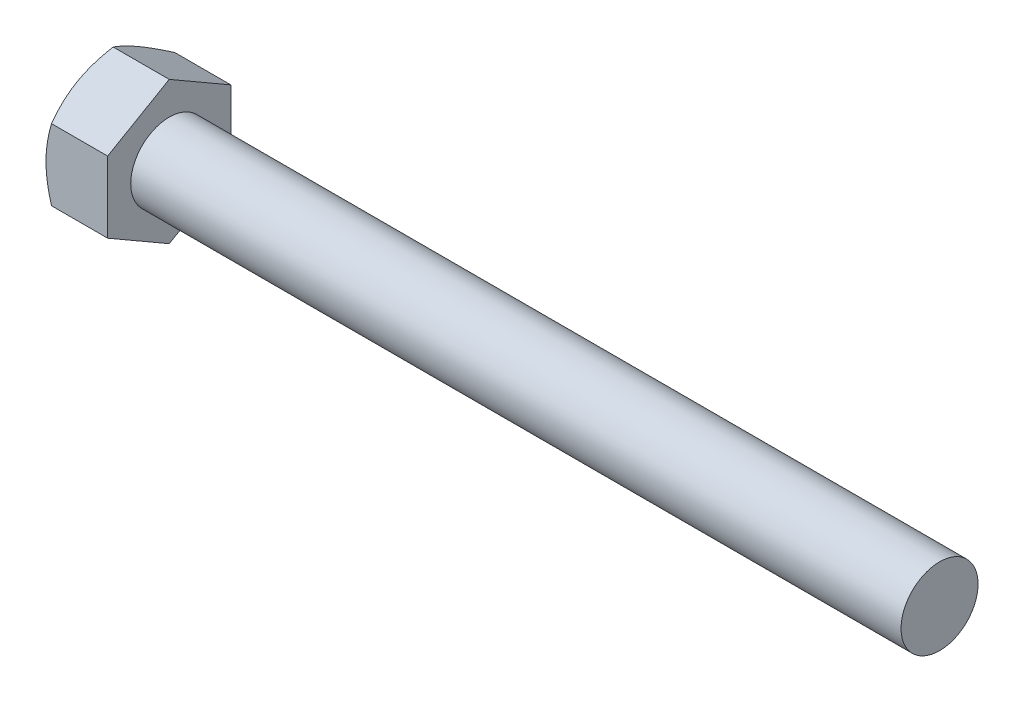
ISO-10303-21;
HEADER;
FILE_DESCRIPTION(('STEP AP214'),'2;1');
FILE_NAME('part.step','',(''),(''),'','','');
FILE_SCHEMA(('AUTOMOTIVE_DESIGN { 1 0 10303 214 1 1 1 1 }'));
ENDSEC;
DATA;
#1=APPLICATION_CONTEXT('core data for automotive mechanical design processes');
#2=APPLICATION_PROTOCOL_DEFINITION('international standard','automotive_design',2000,#1);
#3=PRODUCT_CONTEXT('',#1,'mechanical');
#4=PRODUCT('Part','Part','',(#3));
#5=PRODUCT_RELATED_PRODUCT_CATEGORY('part','',(#4));
#6=PRODUCT_DEFINITION_FORMATION('','',#4);
#7=PRODUCT_DEFINITION_CONTEXT('part definition',#1,'design');
#8=PRODUCT_DEFINITION('design','',#6,#7);
#9=PRODUCT_DEFINITION_SHAPE('','',#8);
#10=(LENGTH_UNIT() NAMED_UNIT(*) SI_UNIT(.MILLI.,.METRE.));
#11=(NAMED_UNIT(*) PLANE_ANGLE_UNIT() SI_UNIT($,.RADIAN.));
#12=(NAMED_UNIT(*) SI_UNIT($,.STERADIAN.) SOLID_ANGLE_UNIT());
#13=UNCERTAINTY_MEASURE_WITH_UNIT(LENGTH_MEASURE(1.E-05),#10,'distance_accuracy_value','');
#14=(GEOMETRIC_REPRESENTATION_CONTEXT(3) GLOBAL_UNCERTAINTY_ASSIGNED_CONTEXT((#13)) GLOBAL_UNIT_ASSIGNED_CONTEXT((#10,
#11,#12)) REPRESENTATION_CONTEXT('',''));
#15=CARTESIAN_POINT('',(0.,0.,0.));
#16=DIRECTION('',(0.,0.,1.));
#17=DIRECTION('',(1.,0.,0.));
#18=AXIS2_PLACEMENT_3D('',#15,#16,#17);
#19=CARTESIAN_POINT('',(1.6,1.,0.));
#20=DIRECTION('',(-1.,0.,0.));
#21=DIRECTION('',(0.,0.,1.));
#22=AXIS2_PLACEMENT_3D('',#19,#20,#21);
#23=PLANE('',#22);
#24=CARTESIAN_POINT('',(1.6,0.,0.));
#25=DIRECTION('',(-1.,0.,0.));
#26=DIRECTION('',(0.,0.,1.));
#27=AXIS2_PLACEMENT_3D('',#24,#25,#26);
#28=CIRCLE('',#27,1.);
#29=CARTESIAN_POINT('',(1.6,0.,1.));
#30=VERTEX_POINT('',#29);
#31=EDGE_CURVE('E195',#30,#30,#28,.T.);
#32=ORIENTED_EDGE('',*,*,#31,.T.);
#33=EDGE_LOOP('',(#32));
#34=FACE_BOUND('',#33,.T.);
#35=DIRECTION('',(0.,1.,0.));
#36=VECTOR('',#35,1.);
#37=CARTESIAN_POINT('',(1.6,-0.923760434740009,1.6));
#38=LINE('',#37,#36);
#39=CARTESIAN_POINT('',(1.6,-0.923760434740009,1.6));
#40=VERTEX_POINT('',#39);
#41=CARTESIAN_POINT('',(1.6,0.923760434740264,1.6));
#42=VERTEX_POINT('',#41);
#43=EDGE_CURVE('E55',#40,#42,#38,.T.);
#44=ORIENTED_EDGE('',*,*,#43,.F.);
#45=DIRECTION('',(0.,0.500000001638709,0.86602540283833));
#46=VECTOR('',#45,1.);
#47=CARTESIAN_POINT('',(1.6,-1.84752086948014,0.));
#48=LINE('',#47,#46);
#49=CARTESIAN_POINT('',(1.6,-1.84752086948014,0.));
#50=VERTEX_POINT('',#49);
#51=EDGE_CURVE('E128',#50,#40,#48,.T.);
#52=ORIENTED_EDGE('',*,*,#51,.F.);
#53=DIRECTION('',(0.,-0.500000001638709,0.866025402838329));
#54=VECTOR('',#53,1.);
#55=CARTESIAN_POINT('',(1.6,-0.923760434740009,-1.6));
#56=LINE('',#55,#54);
#57=CARTESIAN_POINT('',(1.6,-0.923760434740009,-1.6));
#58=VERTEX_POINT('',#57);
#59=EDGE_CURVE('E126',#58,#50,#56,.T.);
#60=ORIENTED_EDGE('',*,*,#59,.F.);
#61=DIRECTION('',(0.,-1.,0.));
#62=VECTOR('',#61,1.);
#63=CARTESIAN_POINT('',(1.6,0.923760434740264,-1.6));
#64=LINE('',#63,#62);
#65=CARTESIAN_POINT('',(1.6,0.923760434740264,-1.6));
#66=VERTEX_POINT('',#65);
#67=EDGE_CURVE('E109',#66,#58,#64,.T.);
#68=ORIENTED_EDGE('',*,*,#67,.F.);
#69=DIRECTION('',(0.,-0.50000000163871,-0.866025402838329));
#70=VECTOR('',#69,1.);
#71=CARTESIAN_POINT('',(1.6,1.8475208694804,0.));
#72=LINE('',#71,#70);
#73=CARTESIAN_POINT('',(1.6,1.8475208694804,0.));
#74=VERTEX_POINT('',#73);
#75=EDGE_CURVE('E118',#74,#66,#72,.T.);
#76=ORIENTED_EDGE('',*,*,#75,.F.);
#77=DIRECTION('',(0.,0.50000000163871,-0.866025402838329));
#78=VECTOR('',#77,1.);
#79=CARTESIAN_POINT('',(1.6,0.923760434740264,1.6));
#80=LINE('',#79,#78);
#81=EDGE_CURVE('E122',#42,#74,#80,.T.);
#82=ORIENTED_EDGE('',*,*,#81,.F.);
#83=EDGE_LOOP('',(#44,#52,#60,#68,#76,#82));
#84=FACE_BOUND('',#83,.T.);
#85=ADVANCED_FACE('F32',(#34,#84),#23,.F.);
#86=CARTESIAN_POINT('',(-25.4,0.,0.));
#87=DIRECTION('',(-1.,0.,0.));
#88=DIRECTION('',(0.,0.,1.));
#89=AXIS2_PLACEMENT_3D('',#86,#87,#88);
#90=CYLINDRICAL_SURFACE('',#89,1.);
#91=CARTESIAN_POINT('',(21.6,0.,0.));
#92=DIRECTION('',(-1.,0.,0.));
#93=DIRECTION('',(0.,0.,1.));
#94=AXIS2_PLACEMENT_3D('',#91,#92,#93);
#95=CIRCLE('',#94,1.);
#96=CARTESIAN_POINT('',(21.6,0.,1.));
#97=VERTEX_POINT('',#96);
#98=EDGE_CURVE('E11',#97,#97,#95,.T.);
#99=ORIENTED_EDGE('',*,*,#98,.T.);
#100=EDGE_LOOP('',(#99));
#101=FACE_BOUND('',#100,.T.);
#102=ORIENTED_EDGE('',*,*,#31,.F.);
#103=EDGE_LOOP('',(#102));
#104=FACE_BOUND('',#103,.T.);
#105=ADVANCED_FACE('F34',(#101,#104),#90,.T.);
#106=CARTESIAN_POINT('',(21.6,1.,0.));
#107=DIRECTION('',(1.,0.,0.));
#108=DIRECTION('',(0.,0.,-1.));
#109=AXIS2_PLACEMENT_3D('',#106,#107,#108);
#110=PLANE('',#109);
#111=ORIENTED_EDGE('',*,*,#98,.F.);
#112=EDGE_LOOP('',(#111));
#113=FACE_BOUND('',#112,.T.);
#114=ADVANCED_FACE('F176',(#113),#110,.T.);
#115=CARTESIAN_POINT('',(1.6,-0.923760434740009,1.6));
#116=DIRECTION('',(0.,0.,1.));
#117=DIRECTION('',(0.,-1.,0.));
#118=AXIS2_PLACEMENT_3D('',#115,#116,#117);
#119=PLANE('',#118);
#120=DIRECTION('',(-1.,0.,0.));
#121=VECTOR('',#120,1.);
#122=CARTESIAN_POINT('',(1.6,-0.923760434740009,1.6));
#123=LINE('',#122,#121);
#124=CARTESIAN_POINT('',(0.142906237128534,-0.923760434740009,1.6));
#125=VERTEX_POINT('',#124);
#126=EDGE_CURVE('E135',#40,#125,#123,.T.);
#127=ORIENTED_EDGE('',*,*,#126,.F.);
#128=ORIENTED_EDGE('',*,*,#43,.T.);
#129=DIRECTION('',(-1.,0.,0.));
#130=VECTOR('',#129,1.);
#131=CARTESIAN_POINT('',(1.6,0.923760434740264,1.6));
#132=LINE('',#131,#130);
#133=CARTESIAN_POINT('',(0.142906237128605,0.923760434740264,1.6));
#134=VERTEX_POINT('',#133);
#135=EDGE_CURVE('E134',#42,#134,#132,.T.);
#136=ORIENTED_EDGE('',*,*,#135,.T.);
#137=CARTESIAN_POINT('',(0.765644828202179,-2.44995313964442,1.60000000000001));
#138=CARTESIAN_POINT('',(0.731696573650797,-2.37970405797874,1.60000000000001));
#139=CARTESIAN_POINT('',(0.698085791483846,-2.30928888479984,1.60000000000001));
#140=CARTESIAN_POINT('',(0.631732015267875,-2.16803654978859,1.60000000000001));
#141=CARTESIAN_POINT('',(0.598989171465694,-2.09719931746054,1.60000000000001));
#142=CARTESIAN_POINT('',(0.534391625180878,-1.95463040365835,1.60000000000001));
#143=CARTESIAN_POINT('',(0.502543077397541,-1.88289592340094,1.60000000000001));
#144=CARTESIAN_POINT('',(0.440213947600505,-1.73883737021895,1.60000000000001));
#145=CARTESIAN_POINT('',(0.409733294281402,-1.66651332825973,1.6));
#146=CARTESIAN_POINT('',(0.350141939702461,-1.52026304024921,1.6));
#147=CARTESIAN_POINT('',(0.321052643615894,-1.44632802431198,1.6));
#148=CARTESIAN_POINT('',(0.265152077517383,-1.29758535512184,1.6));
#149=CARTESIAN_POINT('',(0.238341078622316,-1.22277759921435,1.6));
#150=CARTESIAN_POINT('',(0.187718918744779,-1.0723280156514,1.6));
#151=CARTESIAN_POINT('',(0.163901250515315,-0.996688400121103,1.6));
#152=CARTESIAN_POINT('',(0.120035929316095,-0.844327663434869,1.6));
#153=CARTESIAN_POINT('',(0.0999873935955762,-0.767606800049038,1.6));
#154=CARTESIAN_POINT('',(0.0646370585563195,-0.613040253227076,1.6));
#155=CARTESIAN_POINT('',(0.0493363268649904,-0.53519432091214,1.6));
#156=CARTESIAN_POINT('',(0.0245099593902628,-0.378564482285491,1.6));
#157=CARTESIAN_POINT('',(0.0149843287079924,-0.29978057514533,1.6));
#158=CARTESIAN_POINT('',(0.00255348836303748,-0.142183236095495,1.6));
#159=CARTESIAN_POINT('',(-0.000393634328577223,-0.0633732093612203,1.6));
#160=CARTESIAN_POINT('',(0.000479268304523477,0.0941836095219118,1.6));
#161=CARTESIAN_POINT('',(0.00429753699197445,0.172930412775567,1.6));
#162=CARTESIAN_POINT('',(0.0213790771551431,0.363434812047489,1.6));
#163=CARTESIAN_POINT('',(0.0379858383290378,0.474893231414492,1.6));
#164=CARTESIAN_POINT('',(0.0817587899090965,0.695747937592886,1.6));
#165=CARTESIAN_POINT('',(0.108937403810862,0.805141638878416,1.6));
#166=CARTESIAN_POINT('',(0.155805981368528,0.968865723821623,1.6));
#167=CARTESIAN_POINT('',(0.172684493871444,1.02403323308235,1.6));
#168=CARTESIAN_POINT('',(0.20811227639747,1.13378937357028,1.6));
#169=CARTESIAN_POINT('',(0.226660394050068,1.18837837543755,1.6));
#170=CARTESIAN_POINT('',(0.265040726595979,1.29675310607402,1.6));
#171=CARTESIAN_POINT('',(0.284865126103106,1.35054162671599,1.6));
#172=CARTESIAN_POINT('',(0.325677517040834,1.45770134134685,1.6));
#173=CARTESIAN_POINT('',(0.34666597875204,1.51107235658078,1.6));
#174=CARTESIAN_POINT('',(0.368121670943097,1.56425000996125,1.6));
#175=B_SPLINE_CURVE_WITH_KNOTS('',3,(#137,#138,#139,#140,#141,#142,#143,#144,#145,#146,#147,
#148,#149,#150,#151,#152,#153,#154,#155,#156,#157,#158,#159,#160,#161,#162,#163,#164,#165,#166,
#167,#168,#169,#170,#171,#172,#173,#174),.UNSPECIFIED.,.F.,.F.,(4,2,2,2,2,2,2,2,2,2,2,2,2,2,2,2,
2,2,4),(0.,0.23406885323444,0.468177964432786,0.70362677994028,0.939063307715758,
1.17738940986821,1.4157438331752,1.65357078566775,1.89134196825098,2.12916657919323,
2.36699140020488,2.60329661246141,2.83954047694213,3.17691485506245,3.51468690177223,
3.68774177254085,3.86067810258333,4.03264103265922,4.20467394903791),.UNSPECIFIED.);
#176=CARTESIAN_POINT('',(0.,0.,1.6));
#177=VERTEX_POINT('',#176);
#178=EDGE_CURVE('E178',#177,#134,#175,.T.);
#179=ORIENTED_EDGE('',*,*,#178,.F.);
#180=EDGE_CURVE('E186',#125,#177,#175,.T.);
#181=ORIENTED_EDGE('',*,*,#180,.F.);
#182=EDGE_LOOP('',(#127,#128,#136,#179,#181));
#183=FACE_BOUND('',#182,.T.);
#184=ADVANCED_FACE('F172',(#183),#119,.T.);
#185=CARTESIAN_POINT('',(1.6,-1.84752086948014,0.));
#186=DIRECTION('',(0.,-0.86602540283833,0.500000001638709));
#187=DIRECTION('',(0.,-0.500000001638709,-0.86602540283833));
#188=AXIS2_PLACEMENT_3D('',#185,#186,#187);
#189=PLANE('',#188);
#190=DIRECTION('',(-1.,0.,0.));
#191=VECTOR('',#190,1.);
#192=CARTESIAN_POINT('',(1.6,-1.84752086948014,0.));
#193=LINE('',#192,#191);
#194=CARTESIAN_POINT('',(0.14290624062441,-1.84752086948014,0.));
#195=VERTEX_POINT('',#194);
#196=EDGE_CURVE('E139',#50,#195,#193,.T.);
#197=ORIENTED_EDGE('',*,*,#196,.F.);
#198=ORIENTED_EDGE('',*,*,#51,.T.);
#199=ORIENTED_EDGE('',*,*,#126,.T.);
#200=CARTESIAN_POINT('',(0.142972913540977,-1.84763633953449,-0.000200000000001044));
#201=CARTESIAN_POINT('',(0.119523873841058,-1.80704071400976,0.0701136856666059));
#202=CARTESIAN_POINT('',(0.09819736317521,-1.76609467193232,0.141034310603658));
#203=CARTESIAN_POINT('',(0.0609706598519543,-1.68349347561588,0.284103778764517));
#204=CARTESIAN_POINT('',(0.0450836384739092,-1.64183685301446,0.356255165266601));
#205=CARTESIAN_POINT('',(0.0203517180934994,-1.55903989598294,0.499663700930606));
#206=CARTESIAN_POINT('',(0.011342239792453,-1.51791230529269,0.570898777287726));
#207=CARTESIAN_POINT('',(0.000584274390865681,-1.43546347692822,0.713704336415481));
#208=CARTESIAN_POINT('',(-0.00117311856409557,-1.39414253919205,0.785274299678156));
#209=CARTESIAN_POINT('',(0.00247117592852625,-1.3169235806758,0.919021458551403));
#210=CARTESIAN_POINT('',(0.0069780618484054,-1.28101403562578,0.981218614782927));
#211=CARTESIAN_POINT('',(0.0212658787012267,-1.20942891036882,1.10520768825234));
#212=CARTESIAN_POINT('',(0.0310516964592385,-1.17375357800005,1.16699917622193));
#213=CARTESIAN_POINT('',(0.0555169133780087,-1.10202070318732,1.29124415942763));
#214=CARTESIAN_POINT('',(0.0703000818000002,-1.06597224567772,1.3536819190959));
#215=CARTESIAN_POINT('',(0.103852609308292,-0.994413170643864,1.47762587225554));
#216=CARTESIAN_POINT('',(0.122614078088378,-0.958901635419942,1.53913365524936));
#217=CARTESIAN_POINT('',(0.142972910044446,-0.923644964685666,1.6002));
#218=B_SPLINE_CURVE_WITH_KNOTS('',3,(#200,#201,#202,#203,#204,#205,#206,#207,#208,#209,#210,
#211,#212,#213,#214,#215,#216,#217),.UNSPECIFIED.,.F.,.F.,(4,2,2,2,2,2,2,2,4),(0.,
0.253628623757861,0.507867115703996,0.755812450533006,1.0034532076744,1.21912892099054,
1.43500463361228,1.65567058900752,1.87590291613513),.UNSPECIFIED.);
#219=CARTESIAN_POINT('',(0.,-1.38564064908256,0.800000005243815));
#220=VERTEX_POINT('',#219);
#221=EDGE_CURVE('E188',#220,#125,#218,.T.);
#222=ORIENTED_EDGE('',*,*,#221,.F.);
#223=EDGE_CURVE('E187',#195,#220,#218,.T.);
#224=ORIENTED_EDGE('',*,*,#223,.F.);
#225=EDGE_LOOP('',(#197,#198,#199,#222,#224));
#226=FACE_BOUND('',#225,.T.);
#227=ADVANCED_FACE('F175',(#226),#189,.T.);
#228=CARTESIAN_POINT('',(1.6,-0.923760434740009,-1.6));
#229=DIRECTION('',(0.,-0.866025402838329,-0.500000001638709));
#230=DIRECTION('',(0.,0.500000001638709,-0.86602540283833));
#231=AXIS2_PLACEMENT_3D('',#228,#229,#230);
#232=PLANE('',#231);
#233=DIRECTION('',(-1.,0.,0.));
#234=VECTOR('',#233,1.);
#235=CARTESIAN_POINT('',(1.6,-0.923760434740009,-1.6));
#236=LINE('',#235,#234);
#237=CARTESIAN_POINT('',(0.142906237128534,-0.923760434740009,-1.6));
#238=VERTEX_POINT('',#237);
#239=EDGE_CURVE('E115',#58,#238,#236,.T.);
#240=ORIENTED_EDGE('',*,*,#239,.F.);
#241=ORIENTED_EDGE('',*,*,#59,.T.);
#242=ORIENTED_EDGE('',*,*,#196,.T.);
#243=CARTESIAN_POINT('',(0.142972910044446,-0.923644964685666,-1.6002));
#244=CARTESIAN_POINT('',(0.119523870629411,-0.964240590112128,-1.5298863145036));
#245=CARTESIAN_POINT('',(0.0981973602666751,-1.00518663209069,-1.4589656897378));
#246=CARTESIAN_POINT('',(0.060970657573617,-1.0877878281999,-1.31589622193588));
#247=CARTESIAN_POINT('',(0.0450836365223288,-1.12944445069291,-1.24374483562158));
#248=CARTESIAN_POINT('',(0.0203517167922156,-1.21224140750353,-1.10033630034017));
#249=CARTESIAN_POINT('',(0.0113422388153008,-1.25336899808164,-1.02910122417727));
#250=CARTESIAN_POINT('',(0.000584274038670848,-1.3358178262086,-0.886295665460913));
#251=CARTESIAN_POINT('',(-0.00117311861526707,-1.37713876381941,-0.814725702415368));
#252=CARTESIAN_POINT('',(0.00247117640137259,-1.45435772233075,-0.680978543550625));
#253=CARTESIAN_POINT('',(0.00697806258842818,-1.49026726750218,-0.618781387108811));
#254=CARTESIAN_POINT('',(0.0212658799891534,-1.56185239299221,-0.494792313235711));
#255=CARTESIAN_POINT('',(0.0310516980279486,-1.59752772547262,-0.433000825072748));
#256=CARTESIAN_POINT('',(0.0555169155108661,-1.66926060050638,-0.308755841484233));
#257=CARTESIAN_POINT('',(0.0703000842165112,-1.70530905812515,-0.246318081626867));
#258=CARTESIAN_POINT('',(0.103852612277744,-1.77686813337112,-0.122374128099829));
#259=CARTESIAN_POINT('',(0.122614081327008,-1.81237966869801,-0.060866344927662));
#260=CARTESIAN_POINT('',(0.142972913540977,-1.84763633953449,0.000199999999998999));
#261=B_SPLINE_CURVE_WITH_KNOTS('',3,(#243,#244,#245,#246,#247,#248,#249,#250,#251,#252,#253,
#254,#255,#256,#257,#258,#259,#260),.UNSPECIFIED.,.F.,.F.,(4,2,2,2,2,2,2,2,4),(0.,
0.253628622953062,0.507867114074842,0.75581244812886,1.00345320450202,1.21912891859406,
1.43500463199421,1.65567058820307,1.87590291613512),.UNSPECIFIED.);
#262=CARTESIAN_POINT('',(0.,-1.38564064908256,-0.800000005243816));
#263=VERTEX_POINT('',#262);
#264=EDGE_CURVE('E218',#263,#195,#261,.T.);
#265=ORIENTED_EDGE('',*,*,#264,.F.);
#266=EDGE_CURVE('E223',#238,#263,#261,.T.);
#267=ORIENTED_EDGE('',*,*,#266,.F.);
#268=EDGE_LOOP('',(#240,#241,#242,#265,#267));
#269=FACE_BOUND('',#268,.T.);
#270=ADVANCED_FACE('F294',(#269),#232,.T.);
#271=CARTESIAN_POINT('',(1.6,0.923760434740264,-1.6));
#272=DIRECTION('',(0.,0.,-1.));
#273=DIRECTION('',(0.,1.,0.));
#274=AXIS2_PLACEMENT_3D('',#271,#272,#273);
#275=PLANE('',#274);
#276=DIRECTION('',(-1.,0.,0.));
#277=VECTOR('',#276,1.);
#278=CARTESIAN_POINT('',(1.6,0.923760434740264,-1.6));
#279=LINE('',#278,#277);
#280=CARTESIAN_POINT('',(0.142906237128606,0.923760434740264,-1.6));
#281=VERTEX_POINT('',#280);
#282=EDGE_CURVE('E104',#66,#281,#279,.T.);
#283=ORIENTED_EDGE('',*,*,#282,.F.);
#284=ORIENTED_EDGE('',*,*,#67,.T.);
#285=ORIENTED_EDGE('',*,*,#239,.T.);
#286=CARTESIAN_POINT('',(0.765644828202179,-2.44995313964442,-1.6));
#287=CARTESIAN_POINT('',(0.731696573650797,-2.37970405797874,-1.6));
#288=CARTESIAN_POINT('',(0.698085791483846,-2.30928888479984,-1.6));
#289=CARTESIAN_POINT('',(0.631732015267875,-2.16803654978859,-1.6));
#290=CARTESIAN_POINT('',(0.598989171465694,-2.09719931746054,-1.6));
#291=CARTESIAN_POINT('',(0.534391625180877,-1.95463040365835,-1.6));
#292=CARTESIAN_POINT('',(0.50254307739754,-1.88289592340094,-1.6));
#293=CARTESIAN_POINT('',(0.440213947600504,-1.73883737021895,-1.6));
#294=CARTESIAN_POINT('',(0.409733294281402,-1.66651332825973,-1.6));
#295=CARTESIAN_POINT('',(0.350141939702461,-1.52026304024921,-1.6));
#296=CARTESIAN_POINT('',(0.321052643615894,-1.44632802431197,-1.6));
#297=CARTESIAN_POINT('',(0.265152077517382,-1.29758535512184,-1.6));
#298=CARTESIAN_POINT('',(0.238341078622315,-1.22277759921435,-1.6));
#299=CARTESIAN_POINT('',(0.187718918744778,-1.0723280156514,-1.6));
#300=CARTESIAN_POINT('',(0.163901250515315,-0.996688400121103,-1.6));
#301=CARTESIAN_POINT('',(0.120035929316095,-0.844327663434869,-1.6));
#302=CARTESIAN_POINT('',(0.0999873935955762,-0.767606800049037,-1.6));
#303=CARTESIAN_POINT('',(0.0646370585563196,-0.613040253227076,-1.6));
#304=CARTESIAN_POINT('',(0.0493363268649906,-0.53519432091214,-1.6));
#305=CARTESIAN_POINT('',(0.0245099593902632,-0.378564482285491,-1.6));
#306=CARTESIAN_POINT('',(0.0149843287079928,-0.29978057514533,-1.6));
#307=CARTESIAN_POINT('',(0.00255348836303799,-0.142183236095496,-1.6));
#308=CARTESIAN_POINT('',(-0.000393634328576636,-0.0633732093612206,-1.6));
#309=CARTESIAN_POINT('',(0.000479268304524164,0.0941836095219117,-1.6));
#310=CARTESIAN_POINT('',(0.00429753699197518,0.172930412775567,-1.6));
#311=CARTESIAN_POINT('',(0.021379077155144,0.363434812047489,-1.6));
#312=CARTESIAN_POINT('',(0.0379858383290389,0.474893231414492,-1.6));
#313=CARTESIAN_POINT('',(0.081758789909098,0.695747937592887,-1.6));
#314=CARTESIAN_POINT('',(0.108937403810864,0.805141638878418,-1.6));
#315=CARTESIAN_POINT('',(0.15580598136853,0.968865723821626,-1.6));
#316=CARTESIAN_POINT('',(0.172684493871446,1.02403323308236,-1.6));
#317=CARTESIAN_POINT('',(0.208112276397472,1.13378937357028,-1.6));
#318=CARTESIAN_POINT('',(0.22666039405007,1.18837837543755,-1.6));
#319=CARTESIAN_POINT('',(0.265040726595981,1.29675310607402,-1.6));
#320=CARTESIAN_POINT('',(0.284865126103108,1.35054162671599,-1.6));
#321=CARTESIAN_POINT('',(0.325677517040835,1.45770134134686,-1.6));
#322=CARTESIAN_POINT('',(0.346665978752042,1.51107235658079,-1.6));
#323=CARTESIAN_POINT('',(0.3681216709431,1.56425000996125,-1.6));
#324=B_SPLINE_CURVE_WITH_KNOTS('',3,(#286,#287,#288,#289,#290,#291,#292,#293,#294,#295,#296,
#297,#298,#299,#300,#301,#302,#303,#304,#305,#306,#307,#308,#309,#310,#311,#312,#313,#314,#315,
#316,#317,#318,#319,#320,#321,#322,#323),.UNSPECIFIED.,.F.,.F.,(4,2,2,2,2,2,2,2,2,2,2,2,2,2,2,2,
2,2,4),(0.,0.23406885323444,0.468177964432787,0.703626779940282,0.93906330771576,
1.17738940986821,1.41574383317521,1.65357078566775,1.89134196825098,2.12916657919323,
2.36699140020488,2.60329661246141,2.83954047694213,3.17691485506245,3.51468690177224,
3.68774177254085,3.86067810258334,4.03264103265923,4.20467394903792),.UNSPECIFIED.);
#325=CARTESIAN_POINT('',(0.,0.,-1.6));
#326=VERTEX_POINT('',#325);
#327=EDGE_CURVE('E219',#326,#238,#324,.F.);
#328=ORIENTED_EDGE('',*,*,#327,.F.);
#329=EDGE_CURVE('E112',#281,#326,#324,.F.);
#330=ORIENTED_EDGE('',*,*,#329,.F.);
#331=EDGE_LOOP('',(#283,#284,#285,#328,#330));
#332=FACE_BOUND('',#331,.T.);
#333=ADVANCED_FACE('F106',(#332),#275,.T.);
#334=CARTESIAN_POINT('',(1.6,1.8475208694804,0.));
#335=DIRECTION('',(0.,0.866025402838329,-0.50000000163871));
#336=DIRECTION('',(0.,0.50000000163871,0.866025402838329));
#337=AXIS2_PLACEMENT_3D('',#334,#335,#336);
#338=PLANE('',#337);
#339=DIRECTION('',(-1.,0.,0.));
#340=VECTOR('',#339,1.);
#341=CARTESIAN_POINT('',(1.6,1.8475208694804,0.));
#342=LINE('',#341,#340);
#343=CARTESIAN_POINT('',(0.142906240624557,1.8475208694804,0.));
#344=VERTEX_POINT('',#343);
#345=EDGE_CURVE('E47',#74,#344,#342,.T.);
#346=ORIENTED_EDGE('',*,*,#345,.F.);
#347=ORIENTED_EDGE('',*,*,#75,.T.);
#348=ORIENTED_EDGE('',*,*,#282,.T.);
#349=CARTESIAN_POINT('',(0.142972913541125,1.84763633953474,0.000199999999998877));
#350=CARTESIAN_POINT('',(0.119523873841203,1.80704071401001,-0.0701136856666175));
#351=CARTESIAN_POINT('',(0.0981973631753517,1.76609467193257,-0.14103431060368));
#352=CARTESIAN_POINT('',(0.0609706598520908,1.68349347561611,-0.284103778764557));
#353=CARTESIAN_POINT('',(0.0450836384740435,1.64183685301469,-0.356255165266652));
#354=CARTESIAN_POINT('',(0.0203517180936301,1.55903989598316,-0.499663700930676));
#355=CARTESIAN_POINT('',(0.0113422397925823,1.5179123052929,-0.570898777287806));
#356=CARTESIAN_POINT('',(0.000584274390993384,1.43546347692841,-0.713704336415581));
#357=CARTESIAN_POINT('',(-0.00117311856396809,1.39414253919224,-0.785274299678266));
#358=CARTESIAN_POINT('',(0.00247117592865373,1.31692358067599,-0.919021458551512));
#359=CARTESIAN_POINT('',(0.00697806184853126,1.28101403562597,-0.981218614783026));
#360=CARTESIAN_POINT('',(0.021265878701347,1.20942891036903,-1.10520768825242));
#361=CARTESIAN_POINT('',(0.0310516964593547,1.17375357800026,-1.166999176222));
#362=CARTESIAN_POINT('',(0.055516913378115,1.10202070318754,-1.29124415942767));
#363=CARTESIAN_POINT('',(0.0703000818001006,1.06597224567795,-1.35368191909594));
#364=CARTESIAN_POINT('',(0.103852609308379,0.994413170644107,-1.47762587225556));
#365=CARTESIAN_POINT('',(0.122614078088459,0.958901635420191,-1.53913365524937));
#366=CARTESIAN_POINT('',(0.142972910044518,0.923644964685921,-1.6002));
#367=B_SPLINE_CURVE_WITH_KNOTS('',3,(#349,#350,#351,#352,#353,#354,#355,#356,#357,#358,#359,
#360,#361,#362,#363,#364,#365,#366),.UNSPECIFIED.,.F.,.F.,(4,2,2,2,2,2,2,2,4),(0.,
0.253628623757896,0.507867115704066,0.75581245053311,1.00345320767454,1.21912892099064,
1.43500463361235,1.65567058900754,1.87590291613512),.UNSPECIFIED.);
#368=CARTESIAN_POINT('',(0.,1.38564064908275,-0.800000005243928));
#369=VERTEX_POINT('',#368);
#370=EDGE_CURVE('E154',#369,#281,#367,.T.);
#371=ORIENTED_EDGE('',*,*,#370,.F.);
#372=EDGE_CURVE('E282',#344,#369,#367,.T.);
#373=ORIENTED_EDGE('',*,*,#372,.F.);
#374=EDGE_LOOP('',(#346,#347,#348,#371,#373));
#375=FACE_BOUND('',#374,.T.);
#376=ADVANCED_FACE('F119',(#375),#338,.T.);
#377=CARTESIAN_POINT('',(1.6,0.923760434740264,1.6));
#378=DIRECTION('',(0.,0.866025402838329,0.50000000163871));
#379=DIRECTION('',(0.,-0.50000000163871,0.866025402838329));
#380=AXIS2_PLACEMENT_3D('',#377,#378,#379);
#381=PLANE('',#380);
#382=ORIENTED_EDGE('',*,*,#135,.F.);
#383=ORIENTED_EDGE('',*,*,#81,.T.);
#384=ORIENTED_EDGE('',*,*,#345,.T.);
#385=CARTESIAN_POINT('',(0.142972910044517,0.923644964685921,1.6002));
#386=CARTESIAN_POINT('',(0.119523870629485,0.964240590112386,1.52988631450359));
#387=CARTESIAN_POINT('',(0.0981973602667531,1.00518663209095,1.45896568973779));
#388=CARTESIAN_POINT('',(0.0609706575737033,1.08778782820017,1.31589622193585));
#389=CARTESIAN_POINT('',(0.0450836365224199,1.12944445069318,1.24374483562154));
#390=CARTESIAN_POINT('',(0.0203517167923173,1.21224140750381,1.10033630034012));
#391=CARTESIAN_POINT('',(0.0113422388154083,1.25336899808193,1.02910122417722));
#392=CARTESIAN_POINT('',(0.000584274038790198,1.33581782620889,0.886295665460851));
#393=CARTESIAN_POINT('',(-0.00117311861514154,1.3771387638197,0.814725702415301));
#394=CARTESIAN_POINT('',(0.00247117640150941,1.45435772233104,0.680978543550559));
#395=CARTESIAN_POINT('',(0.00697806258856924,1.49026726750247,0.618781387108751));
#396=CARTESIAN_POINT('',(0.0212658799893007,1.56185239299249,0.494792313235662));
#397=CARTESIAN_POINT('',(0.0310516980280977,1.5975277254729,0.433000825072705));
#398=CARTESIAN_POINT('',(0.0555169155110176,1.66926060050665,0.308755841484202));
#399=CARTESIAN_POINT('',(0.070300084216663,1.70530905812542,0.246318081626842));
#400=CARTESIAN_POINT('',(0.103852612277895,1.77686813337138,0.122374128099815));
#401=CARTESIAN_POINT('',(0.122614081327157,1.81237966869827,0.0608663449276546));
#402=CARTESIAN_POINT('',(0.142972913541125,1.84763633953474,-0.000200000000000969));
#403=B_SPLINE_CURVE_WITH_KNOTS('',3,(#385,#386,#387,#388,#389,#390,#391,#392,#393,#394,#395,
#396,#397,#398,#399,#400,#401,#402),.UNSPECIFIED.,.F.,.F.,(4,2,2,2,2,2,2,2,4),(0.,
0.25362862295308,0.507867114074876,0.755812448128912,1.00345320450209,1.21912891859411,
1.43500463199424,1.65567058820308,1.87590291613511),.UNSPECIFIED.);
#404=CARTESIAN_POINT('',(0.,1.38564064908275,0.800000005243927));
#405=VERTEX_POINT('',#404);
#406=EDGE_CURVE('E138',#405,#344,#403,.T.);
#407=ORIENTED_EDGE('',*,*,#406,.F.);
#408=EDGE_CURVE('E153',#134,#405,#403,.T.);
#409=ORIENTED_EDGE('',*,*,#408,.F.);
#410=EDGE_LOOP('',(#382,#383,#384,#407,#409));
#411=FACE_BOUND('',#410,.T.);
#412=ADVANCED_FACE('F165',(#411),#381,.T.);
#413=CARTESIAN_POINT('',(0.,0.,0.));
#414=DIRECTION('',(1.,0.,0.));
#415=DIRECTION('',(0.,0.,-1.));
#416=AXIS2_PLACEMENT_3D('',#413,#414,#415);
#417=CONICAL_SURFACE('',#416,1.6,1.0471975511966);
#418=CARTESIAN_POINT('',(0.,0.,0.));
#419=DIRECTION('',(-1.,0.,0.));
#420=DIRECTION('',(0.,0.,1.));
#421=AXIS2_PLACEMENT_3D('',#418,#419,#420);
#422=CIRCLE('',#421,1.6);
#423=EDGE_CURVE('E197',#220,#177,#422,.T.);
#424=ORIENTED_EDGE('',*,*,#423,.F.);
#425=ORIENTED_EDGE('',*,*,#221,.T.);
#426=ORIENTED_EDGE('',*,*,#180,.T.);
#427=EDGE_LOOP('',(#424,#425,#426));
#428=FACE_BOUND('',#427,.T.);
#429=ADVANCED_FACE('F169',(#428),#417,.T.);
#430=EDGE_CURVE('E205',#263,#220,#422,.T.);
#431=ORIENTED_EDGE('',*,*,#430,.F.);
#432=ORIENTED_EDGE('',*,*,#264,.T.);
#433=ORIENTED_EDGE('',*,*,#223,.T.);
#434=EDGE_LOOP('',(#431,#432,#433));
#435=FACE_BOUND('',#434,.T.);
#436=ADVANCED_FACE('F228',(#435),#417,.T.);
#437=ORIENTED_EDGE('',*,*,#327,.T.);
#438=ORIENTED_EDGE('',*,*,#266,.T.);
#439=EDGE_CURVE('E208',#326,#263,#422,.T.);
#440=ORIENTED_EDGE('',*,*,#439,.F.);
#441=EDGE_LOOP('',(#437,#438,#440));
#442=FACE_BOUND('',#441,.T.);
#443=ADVANCED_FACE('F161',(#442),#417,.T.);
#444=ORIENTED_EDGE('',*,*,#370,.T.);
#445=ORIENTED_EDGE('',*,*,#329,.T.);
#446=EDGE_CURVE('E204',#369,#326,#422,.T.);
#447=ORIENTED_EDGE('',*,*,#446,.F.);
#448=EDGE_LOOP('',(#444,#445,#447));
#449=FACE_BOUND('',#448,.T.);
#450=ADVANCED_FACE('F217',(#449),#417,.T.);
#451=EDGE_CURVE('E40',#177,#405,#422,.T.);
#452=ORIENTED_EDGE('',*,*,#451,.F.);
#453=ORIENTED_EDGE('',*,*,#178,.T.);
#454=ORIENTED_EDGE('',*,*,#408,.T.);
#455=EDGE_LOOP('',(#452,#453,#454));
#456=FACE_BOUND('',#455,.T.);
#457=ADVANCED_FACE('F256',(#456),#417,.T.);
#458=CARTESIAN_POINT('',(0.,0.,0.));
#459=DIRECTION('',(-1.,0.,0.));
#460=DIRECTION('',(0.,0.,1.));
#461=AXIS2_PLACEMENT_3D('',#458,#459,#460);
#462=PLANE('',#461);
#463=CARTESIAN_POINT('',(0.,0.,0.));
#464=DIRECTION('',(1.,0.,0.));
#465=DIRECTION('',(0.,0.,-1.));
#466=AXIS2_PLACEMENT_3D('',#463,#464,#465);
#467=CIRCLE('',#466,1.4);
#468=CARTESIAN_POINT('',(0.,0.,-1.4));
#469=VERTEX_POINT('',#468);
#470=EDGE_CURVE('E236',#469,#469,#467,.T.);
#471=ORIENTED_EDGE('',*,*,#470,.T.);
#472=EDGE_LOOP('',(#471));
#473=FACE_BOUND('',#472,.T.);
#474=ORIENTED_EDGE('',*,*,#451,.T.);
#475=EDGE_CURVE('E199',#405,#369,#422,.T.);
#476=ORIENTED_EDGE('',*,*,#475,.T.);
#477=ORIENTED_EDGE('',*,*,#446,.T.);
#478=ORIENTED_EDGE('',*,*,#439,.T.);
#479=ORIENTED_EDGE('',*,*,#430,.T.);
#480=ORIENTED_EDGE('',*,*,#423,.T.);
#481=EDGE_LOOP('',(#474,#476,#477,#478,#479,#480));
#482=FACE_BOUND('',#481,.T.);
#483=ADVANCED_FACE('F214',(#473,#482),#462,.T.);
#484=ORIENTED_EDGE('',*,*,#406,.T.);
#485=ORIENTED_EDGE('',*,*,#372,.T.);
#486=ORIENTED_EDGE('',*,*,#475,.F.);
#487=EDGE_LOOP('',(#484,#485,#486));
#488=FACE_BOUND('',#487,.T.);
#489=ADVANCED_FACE('F246',(#488),#417,.T.);
#490=CARTESIAN_POINT('',(0.2,0.,0.));
#491=DIRECTION('',(-1.,0.,0.));
#492=DIRECTION('',(0.,0.,1.));
#493=AXIS2_PLACEMENT_3D('',#490,#491,#492);
#494=CYLINDRICAL_SURFACE('',#493,1.4);
#495=CARTESIAN_POINT('',(0.2,0.,0.));
#496=DIRECTION('',(1.,0.,0.));
#497=DIRECTION('',(0.,0.,-1.));
#498=AXIS2_PLACEMENT_3D('',#495,#496,#497);
#499=CIRCLE('',#498,1.4);
#500=CARTESIAN_POINT('',(0.2,0.,-1.4));
#501=VERTEX_POINT('',#500);
#502=EDGE_CURVE('E233',#501,#501,#499,.T.);
#503=ORIENTED_EDGE('',*,*,#502,.T.);
#504=EDGE_LOOP('',(#503));
#505=FACE_BOUND('',#504,.T.);
#506=ORIENTED_EDGE('',*,*,#470,.F.);
#507=EDGE_LOOP('',(#506));
#508=FACE_BOUND('',#507,.T.);
#509=ADVANCED_FACE('F243',(#505,#508),#494,.F.);
#510=CARTESIAN_POINT('',(0.2,0.,0.));
#511=DIRECTION('',(1.,0.,0.));
#512=DIRECTION('',(0.,0.,-1.));
#513=AXIS2_PLACEMENT_3D('',#510,#511,#512);
#514=PLANE('',#513);
#515=ORIENTED_EDGE('',*,*,#502,.F.);
#516=EDGE_LOOP('',(#515));
#517=FACE_BOUND('',#516,.T.);
#518=ADVANCED_FACE('F245',(#517),#514,.F.);
#519=CLOSED_SHELL('',(#85,#105,#114,#184,#227,#270,#333,#376,#412,#429,#436,#443,#450,#457,#483,
#489,#509,#518));
#520=MANIFOLD_SOLID_BREP('B2',#519);
#521=ADVANCED_BREP_SHAPE_REPRESENTATION('',(#18,#520),#14);
#522=SHAPE_DEFINITION_REPRESENTATION(#9,#521);
ENDSEC;
END-ISO-10303-21;
